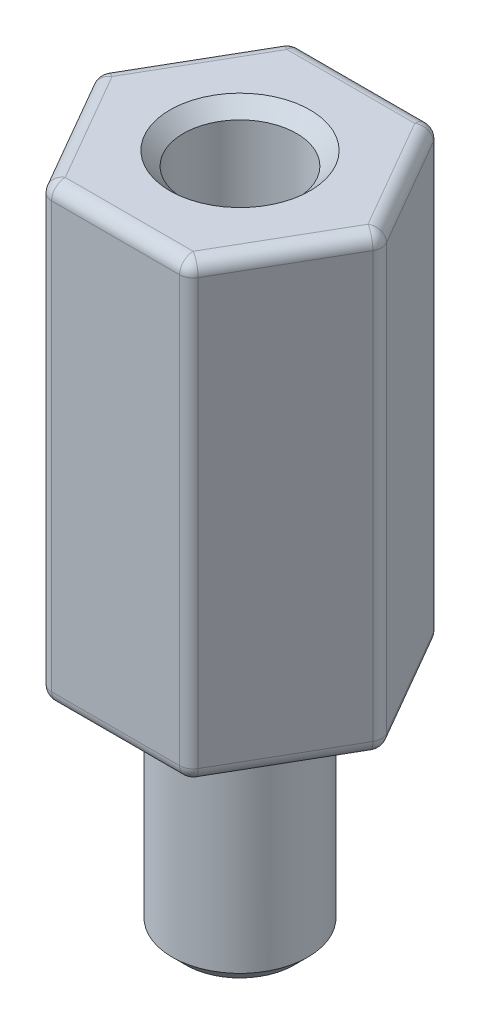
ISO-10303-21;
HEADER;
FILE_DESCRIPTION(('STEP AP214'),'2;1');
FILE_NAME('part.step','',(''),(''),'','','');
FILE_SCHEMA(('AUTOMOTIVE_DESIGN { 1 0 10303 214 1 1 1 1 }'));
ENDSEC;
DATA;
#1=APPLICATION_CONTEXT('core data for automotive mechanical design processes');
#2=APPLICATION_PROTOCOL_DEFINITION('international standard','automotive_design',2000,#1);
#3=PRODUCT_CONTEXT('',#1,'mechanical');
#4=PRODUCT('Part','Part','',(#3));
#5=PRODUCT_RELATED_PRODUCT_CATEGORY('part','',(#4));
#6=PRODUCT_DEFINITION_FORMATION('','',#4);
#7=PRODUCT_DEFINITION_CONTEXT('part definition',#1,'design');
#8=PRODUCT_DEFINITION('design','',#6,#7);
#9=PRODUCT_DEFINITION_SHAPE('','',#8);
#10=(LENGTH_UNIT() NAMED_UNIT(*) SI_UNIT(.MILLI.,.METRE.));
#11=(NAMED_UNIT(*) PLANE_ANGLE_UNIT() SI_UNIT($,.RADIAN.));
#12=(NAMED_UNIT(*) SI_UNIT($,.STERADIAN.) SOLID_ANGLE_UNIT());
#13=UNCERTAINTY_MEASURE_WITH_UNIT(LENGTH_MEASURE(1.E-05),#10,'distance_accuracy_value','');
#14=(GEOMETRIC_REPRESENTATION_CONTEXT(3) GLOBAL_UNCERTAINTY_ASSIGNED_CONTEXT((#13)) GLOBAL_UNIT_ASSIGNED_CONTEXT((#10,
#11,#12)) REPRESENTATION_CONTEXT('',''));
#15=CARTESIAN_POINT('',(0.,0.,0.));
#16=DIRECTION('',(0.,0.,1.));
#17=DIRECTION('',(1.,0.,0.));
#18=AXIS2_PLACEMENT_3D('',#15,#16,#17);
#19=CARTESIAN_POINT('',(0.,10.,0.));
#20=DIRECTION('',(0.,1.,0.));
#21=DIRECTION('',(0.,0.,1.));
#22=AXIS2_PLACEMENT_3D('',#19,#20,#21);
#23=PLANE('',#22);
#24=CARTESIAN_POINT('',(0.,10.,0.));
#25=DIRECTION('',(0.,1.,0.));
#26=DIRECTION('',(0.,0.,1.));
#27=AXIS2_PLACEMENT_3D('',#24,#25,#26);
#28=CIRCLE('',#27,1.55);
#29=CARTESIAN_POINT('',(0.,10.,1.55));
#30=VERTEX_POINT('',#29);
#31=EDGE_CURVE('E288',#30,#30,#28,.F.);
#32=ORIENTED_EDGE('',*,*,#31,.T.);
#33=EDGE_LOOP('',(#32));
#34=FACE_BOUND('',#33,.T.);
#35=DIRECTION('',(-0.5,0.,0.866025403784439));
#36=VECTOR('',#35,1.);
#37=CARTESIAN_POINT('',(-2.82901631902917,10.,0.));
#38=LINE('',#37,#36);
#39=CARTESIAN_POINT('',(-1.41450815951458,10.,-2.45));
#40=VERTEX_POINT('',#39);
#41=CARTESIAN_POINT('',(-2.82901631902917,10.,0.));
#42=VERTEX_POINT('',#41);
#43=EDGE_CURVE('E62',#40,#42,#38,.T.);
#44=ORIENTED_EDGE('',*,*,#43,.T.);
#45=DIRECTION('',(0.5,0.,0.866025403784439));
#46=VECTOR('',#45,1.);
#47=CARTESIAN_POINT('',(-1.41450815951458,10.,2.45));
#48=LINE('',#47,#46);
#49=CARTESIAN_POINT('',(-1.41450815951458,10.,2.45));
#50=VERTEX_POINT('',#49);
#51=EDGE_CURVE('E571',#42,#50,#48,.T.);
#52=ORIENTED_EDGE('',*,*,#51,.T.);
#53=DIRECTION('',(1.,0.,0.));
#54=VECTOR('',#53,1.);
#55=CARTESIAN_POINT('',(1.41450815951458,10.,2.45));
#56=LINE('',#55,#54);
#57=CARTESIAN_POINT('',(1.41450815951458,10.,2.45));
#58=VERTEX_POINT('',#57);
#59=EDGE_CURVE('E563',#50,#58,#56,.T.);
#60=ORIENTED_EDGE('',*,*,#59,.T.);
#61=DIRECTION('',(0.5,0.,-0.866025403784439));
#62=VECTOR('',#61,1.);
#63=CARTESIAN_POINT('',(2.82901631902917,10.,0.));
#64=LINE('',#63,#62);
#65=CARTESIAN_POINT('',(2.82901631902917,10.,0.));
#66=VERTEX_POINT('',#65);
#67=EDGE_CURVE('E565',#58,#66,#64,.T.);
#68=ORIENTED_EDGE('',*,*,#67,.T.);
#69=DIRECTION('',(-0.5,0.,-0.866025403784439));
#70=VECTOR('',#69,1.);
#71=CARTESIAN_POINT('',(1.41450815951459,10.,-2.45));
#72=LINE('',#71,#70);
#73=CARTESIAN_POINT('',(1.41450815951459,10.,-2.45));
#74=VERTEX_POINT('',#73);
#75=EDGE_CURVE('E567',#66,#74,#72,.T.);
#76=ORIENTED_EDGE('',*,*,#75,.T.);
#77=DIRECTION('',(-1.,0.,0.));
#78=VECTOR('',#77,1.);
#79=CARTESIAN_POINT('',(-1.41450815951458,10.,-2.45));
#80=LINE('',#79,#78);
#81=EDGE_CURVE('E67',#74,#40,#80,.T.);
#82=ORIENTED_EDGE('',*,*,#81,.T.);
#83=EDGE_LOOP('',(#44,#52,#60,#68,#76,#82));
#84=FACE_BOUND('',#83,.T.);
#85=ADVANCED_FACE('F47',(#34,#84),#23,.T.);
#86=CARTESIAN_POINT('',(0.,0.,0.));
#87=DIRECTION('',(0.,1.,0.));
#88=DIRECTION('',(0.,0.,1.));
#89=AXIS2_PLACEMENT_3D('',#86,#87,#88);
#90=PLANE('',#89);
#91=CARTESIAN_POINT('',(0.,0.,0.));
#92=DIRECTION('',(0.,1.,0.));
#93=DIRECTION('',(0.,0.,1.));
#94=AXIS2_PLACEMENT_3D('',#91,#92,#93);
#95=CIRCLE('',#94,1.8);
#96=CARTESIAN_POINT('',(0.,0.,1.8));
#97=VERTEX_POINT('',#96);
#98=EDGE_CURVE('E11',#97,#97,#95,.T.);
#99=ORIENTED_EDGE('',*,*,#98,.T.);
#100=EDGE_LOOP('',(#99));
#101=FACE_BOUND('',#100,.T.);
#102=DIRECTION('',(1.,0.,0.));
#103=VECTOR('',#102,1.);
#104=CARTESIAN_POINT('',(0.,0.,2.45));
#105=LINE('',#104,#103);
#106=CARTESIAN_POINT('',(1.41450815951458,0.,2.45));
#107=VERTEX_POINT('',#106);
#108=CARTESIAN_POINT('',(-1.41450815951458,0.,2.45));
#109=VERTEX_POINT('',#108);
#110=EDGE_CURVE('E182',#107,#109,#105,.F.);
#111=ORIENTED_EDGE('',*,*,#110,.T.);
#112=DIRECTION('',(0.5,0.,0.866025403784439));
#113=VECTOR('',#112,1.);
#114=CARTESIAN_POINT('',(-2.12176223927187,0.,1.225));
#115=LINE('',#114,#113);
#116=CARTESIAN_POINT('',(-2.82901631902917,0.,0.));
#117=VERTEX_POINT('',#116);
#118=EDGE_CURVE('E208',#109,#117,#115,.F.);
#119=ORIENTED_EDGE('',*,*,#118,.T.);
#120=DIRECTION('',(-0.5,0.,0.866025403784439));
#121=VECTOR('',#120,1.);
#122=CARTESIAN_POINT('',(-2.12176223927187,0.,-1.225));
#123=LINE('',#122,#121);
#124=CARTESIAN_POINT('',(-1.41450815951458,0.,-2.45));
#125=VERTEX_POINT('',#124);
#126=EDGE_CURVE('E524',#117,#125,#123,.F.);
#127=ORIENTED_EDGE('',*,*,#126,.T.);
#128=DIRECTION('',(-1.,0.,0.));
#129=VECTOR('',#128,1.);
#130=CARTESIAN_POINT('',(0.,0.,-2.45));
#131=LINE('',#130,#129);
#132=CARTESIAN_POINT('',(1.41450815951458,0.,-2.45));
#133=VERTEX_POINT('',#132);
#134=EDGE_CURVE('E522',#125,#133,#131,.F.);
#135=ORIENTED_EDGE('',*,*,#134,.T.);
#136=DIRECTION('',(-0.5,0.,-0.866025403784439));
#137=VECTOR('',#136,1.);
#138=CARTESIAN_POINT('',(2.12176223927188,0.,-1.225));
#139=LINE('',#138,#137);
#140=CARTESIAN_POINT('',(2.82901631902917,0.,0.));
#141=VERTEX_POINT('',#140);
#142=EDGE_CURVE('E520',#133,#141,#139,.F.);
#143=ORIENTED_EDGE('',*,*,#142,.T.);
#144=DIRECTION('',(0.5,0.,-0.866025403784439));
#145=VECTOR('',#144,1.);
#146=CARTESIAN_POINT('',(2.12176223927187,0.,1.225));
#147=LINE('',#146,#145);
#148=EDGE_CURVE('E518',#141,#107,#147,.F.);
#149=ORIENTED_EDGE('',*,*,#148,.T.);
#150=EDGE_LOOP('',(#111,#119,#127,#135,#143,#149));
#151=FACE_BOUND('',#150,.T.);
#152=ADVANCED_FACE('F307',(#101,#151),#90,.F.);
#153=CARTESIAN_POINT('',(1.58771324027147,10.,-2.75));
#154=DIRECTION('',(0.,0.,1.));
#155=DIRECTION('',(1.,0.,0.));
#156=AXIS2_PLACEMENT_3D('',#153,#154,#155);
#157=PLANE('',#156);
#158=DIRECTION('',(0.,-1.,0.));
#159=VECTOR('',#158,1.);
#160=CARTESIAN_POINT('',(1.41450815951458,10.,-2.75));
#161=LINE('',#160,#159);
#162=CARTESIAN_POINT('',(1.41450815951458,9.7,-2.75));
#163=VERTEX_POINT('',#162);
#164=CARTESIAN_POINT('',(1.41450815951458,0.3,-2.75));
#165=VERTEX_POINT('',#164);
#166=EDGE_CURVE('E487',#163,#165,#161,.T.);
#167=ORIENTED_EDGE('',*,*,#166,.T.);
#168=DIRECTION('',(-1.,0.,0.));
#169=VECTOR('',#168,1.);
#170=CARTESIAN_POINT('',(1.58771324027147,0.3,-2.75));
#171=LINE('',#170,#169);
#172=CARTESIAN_POINT('',(-1.41450815951458,0.3,-2.75));
#173=VERTEX_POINT('',#172);
#174=EDGE_CURVE('E541',#165,#173,#171,.T.);
#175=ORIENTED_EDGE('',*,*,#174,.T.);
#176=DIRECTION('',(0.,-1.,0.));
#177=VECTOR('',#176,1.);
#178=CARTESIAN_POINT('',(-1.41450815951458,10.,-2.75));
#179=LINE('',#178,#177);
#180=CARTESIAN_POINT('',(-1.41450815951458,9.7,-2.75));
#181=VERTEX_POINT('',#180);
#182=EDGE_CURVE('E484',#173,#181,#179,.F.);
#183=ORIENTED_EDGE('',*,*,#182,.T.);
#184=DIRECTION('',(-1.,0.,0.));
#185=VECTOR('',#184,1.);
#186=CARTESIAN_POINT('',(1.41450815951458,9.7,-2.75));
#187=LINE('',#186,#185);
#188=EDGE_CURVE('E539',#181,#163,#187,.F.);
#189=ORIENTED_EDGE('',*,*,#188,.T.);
#190=EDGE_LOOP('',(#167,#175,#183,#189));
#191=FACE_BOUND('',#190,.T.);
#192=ADVANCED_FACE('F315',(#191),#157,.F.);
#193=CARTESIAN_POINT('',(-1.58771324027147,10.,-2.75));
#194=DIRECTION('',(0.866025403784439,0.,0.5));
#195=DIRECTION('',(0.5,0.,-0.866025403784439));
#196=AXIS2_PLACEMENT_3D('',#193,#194,#195);
#197=PLANE('',#196);
#198=DIRECTION('',(0.,-1.,0.));
#199=VECTOR('',#198,1.);
#200=CARTESIAN_POINT('',(-1.67431578064991,10.,-2.6));
#201=LINE('',#200,#199);
#202=CARTESIAN_POINT('',(-1.67431578064991,9.7,-2.6));
#203=VERTEX_POINT('',#202);
#204=CARTESIAN_POINT('',(-1.67431578064991,0.3,-2.6));
#205=VERTEX_POINT('',#204);
#206=EDGE_CURVE('E195',#203,#205,#201,.T.);
#207=ORIENTED_EDGE('',*,*,#206,.T.);
#208=DIRECTION('',(-0.5,0.,0.866025403784439));
#209=VECTOR('',#208,1.);
#210=CARTESIAN_POINT('',(-1.58771324027147,0.3,-2.75));
#211=LINE('',#210,#209);
#212=CARTESIAN_POINT('',(-3.0888239401645,0.3,-0.15));
#213=VERTEX_POINT('',#212);
#214=EDGE_CURVE('E533',#205,#213,#211,.T.);
#215=ORIENTED_EDGE('',*,*,#214,.T.);
#216=DIRECTION('',(0.,-1.,0.));
#217=VECTOR('',#216,1.);
#218=CARTESIAN_POINT('',(-3.0888239401645,10.,-0.15));
#219=LINE('',#218,#217);
#220=CARTESIAN_POINT('',(-3.0888239401645,9.7,-0.15));
#221=VERTEX_POINT('',#220);
#222=EDGE_CURVE('E504',#213,#221,#219,.F.);
#223=ORIENTED_EDGE('',*,*,#222,.T.);
#224=DIRECTION('',(-0.5,0.,0.866025403784439));
#225=VECTOR('',#224,1.);
#226=CARTESIAN_POINT('',(-1.67431578064991,9.7,-2.6));
#227=LINE('',#226,#225);
#228=EDGE_CURVE('E531',#221,#203,#227,.F.);
#229=ORIENTED_EDGE('',*,*,#228,.T.);
#230=EDGE_LOOP('',(#207,#215,#223,#229));
#231=FACE_BOUND('',#230,.T.);
#232=ADVANCED_FACE('F336',(#231),#197,.F.);
#233=CARTESIAN_POINT('',(-3.17542648054294,10.,0.));
#234=DIRECTION('',(0.866025403784439,0.,-0.5));
#235=DIRECTION('',(-0.5,0.,-0.866025403784439));
#236=AXIS2_PLACEMENT_3D('',#233,#234,#235);
#237=PLANE('',#236);
#238=DIRECTION('',(0.,-1.,0.));
#239=VECTOR('',#238,1.);
#240=CARTESIAN_POINT('',(-3.0888239401645,10.,0.149999999999999));
#241=LINE('',#240,#239);
#242=CARTESIAN_POINT('',(-3.0888239401645,9.7,0.149999999999999));
#243=VERTEX_POINT('',#242);
#244=CARTESIAN_POINT('',(-3.0888239401645,0.3,0.149999999999999));
#245=VERTEX_POINT('',#244);
#246=EDGE_CURVE('E178',#243,#245,#241,.T.);
#247=ORIENTED_EDGE('',*,*,#246,.T.);
#248=DIRECTION('',(0.5,0.,0.866025403784439));
#249=VECTOR('',#248,1.);
#250=CARTESIAN_POINT('',(-3.17542648054294,0.3,0.));
#251=LINE('',#250,#249);
#252=CARTESIAN_POINT('',(-1.67431578064992,0.3,2.6));
#253=VERTEX_POINT('',#252);
#254=EDGE_CURVE('E173',#245,#253,#251,.T.);
#255=ORIENTED_EDGE('',*,*,#254,.T.);
#256=DIRECTION('',(0.,-1.,0.));
#257=VECTOR('',#256,1.);
#258=CARTESIAN_POINT('',(-1.67431578064992,10.,2.6));
#259=LINE('',#258,#257);
#260=CARTESIAN_POINT('',(-1.67431578064992,9.7,2.6));
#261=VERTEX_POINT('',#260);
#262=EDGE_CURVE('E176',#253,#261,#259,.F.);
#263=ORIENTED_EDGE('',*,*,#262,.T.);
#264=DIRECTION('',(0.5,0.,0.866025403784439));
#265=VECTOR('',#264,1.);
#266=CARTESIAN_POINT('',(-3.0888239401645,9.7,0.149999999999999));
#267=LINE('',#266,#265);
#268=EDGE_CURVE('E183',#261,#243,#267,.F.);
#269=ORIENTED_EDGE('',*,*,#268,.T.);
#270=EDGE_LOOP('',(#247,#255,#263,#269));
#271=FACE_BOUND('',#270,.T.);
#272=ADVANCED_FACE('F175',(#271),#237,.F.);
#273=CARTESIAN_POINT('',(-1.58771324027147,10.,2.75));
#274=DIRECTION('',(0.,0.,-1.));
#275=DIRECTION('',(-1.,0.,0.));
#276=AXIS2_PLACEMENT_3D('',#273,#274,#275);
#277=PLANE('',#276);
#278=DIRECTION('',(0.,-1.,0.));
#279=VECTOR('',#278,1.);
#280=CARTESIAN_POINT('',(-1.41450815951458,10.,2.75));
#281=LINE('',#280,#279);
#282=CARTESIAN_POINT('',(-1.41450815951458,9.7,2.75));
#283=VERTEX_POINT('',#282);
#284=CARTESIAN_POINT('',(-1.41450815951458,0.3,2.75));
#285=VERTEX_POINT('',#284);
#286=EDGE_CURVE('E513',#283,#285,#281,.T.);
#287=ORIENTED_EDGE('',*,*,#286,.T.);
#288=DIRECTION('',(1.,0.,0.));
#289=VECTOR('',#288,1.);
#290=CARTESIAN_POINT('',(-1.58771324027147,0.3,2.75));
#291=LINE('',#290,#289);
#292=CARTESIAN_POINT('',(1.41450815951458,0.3,2.75));
#293=VERTEX_POINT('',#292);
#294=EDGE_CURVE('E217',#285,#293,#291,.T.);
#295=ORIENTED_EDGE('',*,*,#294,.T.);
#296=DIRECTION('',(0.,-1.,0.));
#297=VECTOR('',#296,1.);
#298=CARTESIAN_POINT('',(1.41450815951458,10.,2.75));
#299=LINE('',#298,#297);
#300=CARTESIAN_POINT('',(1.41450815951458,9.7,2.75));
#301=VERTEX_POINT('',#300);
#302=EDGE_CURVE('E510',#293,#301,#299,.F.);
#303=ORIENTED_EDGE('',*,*,#302,.T.);
#304=DIRECTION('',(1.,0.,0.));
#305=VECTOR('',#304,1.);
#306=CARTESIAN_POINT('',(-1.41450815951458,9.7,2.75));
#307=LINE('',#306,#305);
#308=EDGE_CURVE('E572',#301,#283,#307,.F.);
#309=ORIENTED_EDGE('',*,*,#308,.T.);
#310=EDGE_LOOP('',(#287,#295,#303,#309));
#311=FACE_BOUND('',#310,.T.);
#312=ADVANCED_FACE('F329',(#311),#277,.F.);
#313=CARTESIAN_POINT('',(1.58771324027147,10.,2.75));
#314=DIRECTION('',(-0.866025403784439,0.,-0.5));
#315=DIRECTION('',(-0.5,0.,0.866025403784439));
#316=AXIS2_PLACEMENT_3D('',#313,#314,#315);
#317=PLANE('',#316);
#318=DIRECTION('',(0.,-1.,0.));
#319=VECTOR('',#318,1.);
#320=CARTESIAN_POINT('',(1.67431578064991,10.,2.6));
#321=LINE('',#320,#319);
#322=CARTESIAN_POINT('',(1.67431578064991,9.7,2.6));
#323=VERTEX_POINT('',#322);
#324=CARTESIAN_POINT('',(1.67431578064991,0.3,2.6));
#325=VERTEX_POINT('',#324);
#326=EDGE_CURVE('E498',#323,#325,#321,.T.);
#327=ORIENTED_EDGE('',*,*,#326,.T.);
#328=DIRECTION('',(0.5,0.,-0.866025403784439));
#329=VECTOR('',#328,1.);
#330=CARTESIAN_POINT('',(1.58771324027147,0.3,2.75));
#331=LINE('',#330,#329);
#332=CARTESIAN_POINT('',(3.0888239401645,0.3,0.149999999999998));
#333=VERTEX_POINT('',#332);
#334=EDGE_CURVE('E557',#325,#333,#331,.T.);
#335=ORIENTED_EDGE('',*,*,#334,.T.);
#336=DIRECTION('',(0.,-1.,0.));
#337=VECTOR('',#336,1.);
#338=CARTESIAN_POINT('',(3.0888239401645,10.,0.149999999999998));
#339=LINE('',#338,#337);
#340=CARTESIAN_POINT('',(3.0888239401645,9.7,0.149999999999998));
#341=VERTEX_POINT('',#340);
#342=EDGE_CURVE('E501',#333,#341,#339,.F.);
#343=ORIENTED_EDGE('',*,*,#342,.T.);
#344=DIRECTION('',(0.5,0.,-0.866025403784439));
#345=VECTOR('',#344,1.);
#346=CARTESIAN_POINT('',(1.67431578064991,9.7,2.6));
#347=LINE('',#346,#345);
#348=EDGE_CURVE('E555',#341,#323,#347,.F.);
#349=ORIENTED_EDGE('',*,*,#348,.T.);
#350=EDGE_LOOP('',(#327,#335,#343,#349));
#351=FACE_BOUND('',#350,.T.);
#352=ADVANCED_FACE('F325',(#351),#317,.F.);
#353=CARTESIAN_POINT('',(3.17542648054294,10.,0.));
#354=DIRECTION('',(-0.866025403784439,0.,0.5));
#355=DIRECTION('',(0.5,0.,0.866025403784439));
#356=AXIS2_PLACEMENT_3D('',#353,#354,#355);
#357=PLANE('',#356);
#358=DIRECTION('',(0.,-1.,0.));
#359=VECTOR('',#358,1.);
#360=CARTESIAN_POINT('',(3.0888239401645,10.,-0.150000000000002));
#361=LINE('',#360,#359);
#362=CARTESIAN_POINT('',(3.0888239401645,9.7,-0.150000000000002));
#363=VERTEX_POINT('',#362);
#364=CARTESIAN_POINT('',(3.0888239401645,0.3,-0.150000000000002));
#365=VERTEX_POINT('',#364);
#366=EDGE_CURVE('E492',#363,#365,#361,.T.);
#367=ORIENTED_EDGE('',*,*,#366,.T.);
#368=DIRECTION('',(-0.5,0.,-0.866025403784439));
#369=VECTOR('',#368,1.);
#370=CARTESIAN_POINT('',(3.17542648054294,0.3,0.));
#371=LINE('',#370,#369);
#372=CARTESIAN_POINT('',(1.67431578064992,0.3,-2.6));
#373=VERTEX_POINT('',#372);
#374=EDGE_CURVE('E549',#365,#373,#371,.T.);
#375=ORIENTED_EDGE('',*,*,#374,.T.);
#376=DIRECTION('',(0.,-1.,0.));
#377=VECTOR('',#376,1.);
#378=CARTESIAN_POINT('',(1.67431578064992,10.,-2.6));
#379=LINE('',#378,#377);
#380=CARTESIAN_POINT('',(1.67431578064992,9.7,-2.6));
#381=VERTEX_POINT('',#380);
#382=EDGE_CURVE('E495',#373,#381,#379,.F.);
#383=ORIENTED_EDGE('',*,*,#382,.T.);
#384=DIRECTION('',(-0.5,0.,-0.866025403784439));
#385=VECTOR('',#384,1.);
#386=CARTESIAN_POINT('',(3.0888239401645,9.7,-0.150000000000002));
#387=LINE('',#386,#385);
#388=EDGE_CURVE('E547',#381,#363,#387,.F.);
#389=ORIENTED_EDGE('',*,*,#388,.T.);
#390=EDGE_LOOP('',(#367,#375,#383,#389));
#391=FACE_BOUND('',#390,.T.);
#392=ADVANCED_FACE('F322',(#391),#357,.F.);
#393=CARTESIAN_POINT('',(0.,10.,0.));
#394=DIRECTION('',(0.,-1.,0.));
#395=DIRECTION('',(0.,0.,-1.));
#396=AXIS2_PLACEMENT_3D('',#393,#394,#395);
#397=CYLINDRICAL_SURFACE('',#396,1.25);
#398=CARTESIAN_POINT('',(0.,9.7,0.));
#399=DIRECTION('',(0.,1.,0.));
#400=DIRECTION('',(0.,0.,1.));
#401=AXIS2_PLACEMENT_3D('',#398,#399,#400);
#402=CIRCLE('',#401,1.25);
#403=CARTESIAN_POINT('',(0.,9.7,1.25));
#404=VERTEX_POINT('',#403);
#405=EDGE_CURVE('E285',#404,#404,#402,.T.);
#406=ORIENTED_EDGE('',*,*,#405,.T.);
#407=EDGE_LOOP('',(#406));
#408=FACE_BOUND('',#407,.T.);
#409=CARTESIAN_POINT('',(0.,0.,0.));
#410=DIRECTION('',(0.,1.,0.));
#411=DIRECTION('',(0.,0.,1.));
#412=AXIS2_PLACEMENT_3D('',#409,#410,#411);
#413=CIRCLE('',#412,1.25);
#414=CARTESIAN_POINT('',(0.,0.,1.25));
#415=VERTEX_POINT('',#414);
#416=EDGE_CURVE('E248',#415,#415,#413,.T.);
#417=ORIENTED_EDGE('',*,*,#416,.F.);
#418=EDGE_LOOP('',(#417));
#419=FACE_BOUND('',#418,.T.);
#420=ADVANCED_FACE('F319',(#408,#419),#397,.F.);
#421=CARTESIAN_POINT('',(1.41450815951458,10.,-2.45));
#422=DIRECTION('',(0.,-1.,0.));
#423=DIRECTION('',(0.,0.,-1.));
#424=AXIS2_PLACEMENT_3D('',#421,#422,#423);
#425=CYLINDRICAL_SURFACE('',#424,0.3);
#426=ORIENTED_EDGE('',*,*,#382,.F.);
#427=CARTESIAN_POINT('',(1.41450815951458,0.3,-2.45));
#428=DIRECTION('',(0.,-1.,0.));
#429=DIRECTION('',(0.,0.,-1.));
#430=AXIS2_PLACEMENT_3D('',#427,#428,#429);
#431=CIRCLE('',#430,0.3);
#432=EDGE_CURVE('E545',#373,#165,#431,.F.);
#433=ORIENTED_EDGE('',*,*,#432,.T.);
#434=ORIENTED_EDGE('',*,*,#166,.F.);
#435=CARTESIAN_POINT('',(1.41450815951458,9.7,-2.45));
#436=DIRECTION('',(0.,-1.,0.));
#437=DIRECTION('',(0.,0.,-1.));
#438=AXIS2_PLACEMENT_3D('',#435,#436,#437);
#439=CIRCLE('',#438,0.3);
#440=EDGE_CURVE('E543',#163,#381,#439,.T.);
#441=ORIENTED_EDGE('',*,*,#440,.T.);
#442=EDGE_LOOP('',(#426,#433,#434,#441));
#443=FACE_BOUND('',#442,.T.);
#444=ADVANCED_FACE('F343',(#443),#425,.T.);
#445=CARTESIAN_POINT('',(2.82901631902917,10.,0.));
#446=DIRECTION('',(0.,-1.,0.));
#447=DIRECTION('',(0.,0.,-1.));
#448=AXIS2_PLACEMENT_3D('',#445,#446,#447);
#449=CYLINDRICAL_SURFACE('',#448,0.3);
#450=ORIENTED_EDGE('',*,*,#342,.F.);
#451=CARTESIAN_POINT('',(2.82901631902917,0.3,0.));
#452=DIRECTION('',(0.,-1.,0.));
#453=DIRECTION('',(0.,0.,-1.));
#454=AXIS2_PLACEMENT_3D('',#451,#452,#453);
#455=CIRCLE('',#454,0.3);
#456=EDGE_CURVE('E553',#333,#365,#455,.F.);
#457=ORIENTED_EDGE('',*,*,#456,.T.);
#458=ORIENTED_EDGE('',*,*,#366,.F.);
#459=CARTESIAN_POINT('',(2.82901631902917,9.7,0.));
#460=DIRECTION('',(0.,-1.,0.));
#461=DIRECTION('',(0.,0.,-1.));
#462=AXIS2_PLACEMENT_3D('',#459,#460,#461);
#463=CIRCLE('',#462,0.3);
#464=EDGE_CURVE('E551',#363,#341,#463,.T.);
#465=ORIENTED_EDGE('',*,*,#464,.T.);
#466=EDGE_LOOP('',(#450,#457,#458,#465));
#467=FACE_BOUND('',#466,.T.);
#468=ADVANCED_FACE('F346',(#467),#449,.T.);
#469=CARTESIAN_POINT('',(-1.41450815951458,10.,-2.45));
#470=DIRECTION('',(0.,-1.,0.));
#471=DIRECTION('',(0.,0.,-1.));
#472=AXIS2_PLACEMENT_3D('',#469,#470,#471);
#473=CYLINDRICAL_SURFACE('',#472,0.3);
#474=ORIENTED_EDGE('',*,*,#182,.F.);
#475=CARTESIAN_POINT('',(-1.41450815951458,0.3,-2.45));
#476=DIRECTION('',(0.,-1.,0.));
#477=DIRECTION('',(0.,0.,-1.));
#478=AXIS2_PLACEMENT_3D('',#475,#476,#477);
#479=CIRCLE('',#478,0.3);
#480=EDGE_CURVE('E537',#173,#205,#479,.F.);
#481=ORIENTED_EDGE('',*,*,#480,.T.);
#482=ORIENTED_EDGE('',*,*,#206,.F.);
#483=CARTESIAN_POINT('',(-1.41450815951458,9.7,-2.45));
#484=DIRECTION('',(0.,-1.,0.));
#485=DIRECTION('',(0.,0.,-1.));
#486=AXIS2_PLACEMENT_3D('',#483,#484,#485);
#487=CIRCLE('',#486,0.3);
#488=EDGE_CURVE('E535',#203,#181,#487,.T.);
#489=ORIENTED_EDGE('',*,*,#488,.T.);
#490=EDGE_LOOP('',(#474,#481,#482,#489));
#491=FACE_BOUND('',#490,.T.);
#492=ADVANCED_FACE('F350',(#491),#473,.T.);
#493=CARTESIAN_POINT('',(-2.82901631902917,10.,0.));
#494=DIRECTION('',(0.,-1.,0.));
#495=DIRECTION('',(0.,0.,-1.));
#496=AXIS2_PLACEMENT_3D('',#493,#494,#495);
#497=CYLINDRICAL_SURFACE('',#496,0.3);
#498=ORIENTED_EDGE('',*,*,#222,.F.);
#499=CARTESIAN_POINT('',(-2.82901631902917,0.3,0.));
#500=DIRECTION('',(0.,-1.,0.));
#501=DIRECTION('',(0.,0.,-1.));
#502=AXIS2_PLACEMENT_3D('',#499,#500,#501);
#503=CIRCLE('',#502,0.3);
#504=EDGE_CURVE('E529',#213,#245,#503,.F.);
#505=ORIENTED_EDGE('',*,*,#504,.T.);
#506=ORIENTED_EDGE('',*,*,#246,.F.);
#507=CARTESIAN_POINT('',(-2.82901631902917,9.7,0.));
#508=DIRECTION('',(0.,-1.,0.));
#509=DIRECTION('',(0.,0.,-1.));
#510=AXIS2_PLACEMENT_3D('',#507,#508,#509);
#511=CIRCLE('',#510,0.3);
#512=EDGE_CURVE('E527',#243,#221,#511,.T.);
#513=ORIENTED_EDGE('',*,*,#512,.T.);
#514=EDGE_LOOP('',(#498,#505,#506,#513));
#515=FACE_BOUND('',#514,.T.);
#516=ADVANCED_FACE('F354',(#515),#497,.T.);
#517=CARTESIAN_POINT('',(-1.41450815951458,10.,2.45));
#518=DIRECTION('',(0.,-1.,0.));
#519=DIRECTION('',(0.,0.,-1.));
#520=AXIS2_PLACEMENT_3D('',#517,#518,#519);
#521=CYLINDRICAL_SURFACE('',#520,0.3);
#522=ORIENTED_EDGE('',*,*,#262,.F.);
#523=CARTESIAN_POINT('',(-1.41450815951458,0.3,2.45));
#524=DIRECTION('',(0.,-1.,0.));
#525=DIRECTION('',(0.,0.,-1.));
#526=AXIS2_PLACEMENT_3D('',#523,#524,#525);
#527=CIRCLE('',#526,0.3);
#528=EDGE_CURVE('E191',#253,#285,#527,.F.);
#529=ORIENTED_EDGE('',*,*,#528,.T.);
#530=ORIENTED_EDGE('',*,*,#286,.F.);
#531=CARTESIAN_POINT('',(-1.41450815951458,9.7,2.45));
#532=DIRECTION('',(0.,-1.,0.));
#533=DIRECTION('',(0.,0.,-1.));
#534=AXIS2_PLACEMENT_3D('',#531,#532,#533);
#535=CIRCLE('',#534,0.3);
#536=EDGE_CURVE('E194',#283,#261,#535,.T.);
#537=ORIENTED_EDGE('',*,*,#536,.T.);
#538=EDGE_LOOP('',(#522,#529,#530,#537));
#539=FACE_BOUND('',#538,.T.);
#540=ADVANCED_FACE('F189',(#539),#521,.T.);
#541=CARTESIAN_POINT('',(1.41450815951458,10.,2.45));
#542=DIRECTION('',(0.,-1.,0.));
#543=DIRECTION('',(0.,0.,-1.));
#544=AXIS2_PLACEMENT_3D('',#541,#542,#543);
#545=CYLINDRICAL_SURFACE('',#544,0.3);
#546=ORIENTED_EDGE('',*,*,#302,.F.);
#547=CARTESIAN_POINT('',(1.41450815951458,0.3,2.45));
#548=DIRECTION('',(0.,-1.,0.));
#549=DIRECTION('',(0.,0.,-1.));
#550=AXIS2_PLACEMENT_3D('',#547,#548,#549);
#551=CIRCLE('',#550,0.3);
#552=EDGE_CURVE('E561',#293,#325,#551,.F.);
#553=ORIENTED_EDGE('',*,*,#552,.T.);
#554=ORIENTED_EDGE('',*,*,#326,.F.);
#555=CARTESIAN_POINT('',(1.41450815951458,9.7,2.45));
#556=DIRECTION('',(0.,-1.,0.));
#557=DIRECTION('',(0.,0.,-1.));
#558=AXIS2_PLACEMENT_3D('',#555,#556,#557);
#559=CIRCLE('',#558,0.3);
#560=EDGE_CURVE('E559',#323,#301,#559,.T.);
#561=ORIENTED_EDGE('',*,*,#560,.T.);
#562=EDGE_LOOP('',(#546,#553,#554,#561));
#563=FACE_BOUND('',#562,.T.);
#564=ADVANCED_FACE('F361',(#563),#545,.T.);
#565=CARTESIAN_POINT('',(1.41450815951458,0.3,-2.45));
#566=DIRECTION('',(0.,1.,0.));
#567=DIRECTION('',(0.,0.,1.));
#568=AXIS2_PLACEMENT_3D('',#565,#566,#567);
#569=SPHERICAL_SURFACE('',#568,0.3);
#570=CARTESIAN_POINT('',(1.41450815951458,0.3,-2.45));
#571=DIRECTION('',(-1.,0.,0.));
#572=DIRECTION('',(0.,0.,1.));
#573=AXIS2_PLACEMENT_3D('',#570,#571,#572);
#574=CIRCLE('',#573,0.3);
#575=EDGE_CURVE('E242',#165,#133,#574,.T.);
#576=ORIENTED_EDGE('',*,*,#575,.F.);
#577=ORIENTED_EDGE('',*,*,#432,.F.);
#578=CARTESIAN_POINT('',(1.41450815951458,0.3,-2.45));
#579=DIRECTION('',(0.499999999999999,0.,0.866025403784439));
#580=DIRECTION('',(0.866025403784439,0.,-0.499999999999999));
#581=AXIS2_PLACEMENT_3D('',#578,#579,#580);
#582=CIRCLE('',#581,0.3);
#583=EDGE_CURVE('E245',#133,#373,#582,.T.);
#584=ORIENTED_EDGE('',*,*,#583,.F.);
#585=EDGE_LOOP('',(#576,#577,#584));
#586=FACE_BOUND('',#585,.T.);
#587=ADVANCED_FACE('F364',(#586),#569,.T.);
#588=CARTESIAN_POINT('',(2.91561885940761,0.3,0.149999999999998));
#589=DIRECTION('',(-0.5,0.,-0.866025403784439));
#590=DIRECTION('',(-0.866025403784439,0.,0.5));
#591=AXIS2_PLACEMENT_3D('',#588,#589,#590);
#592=CYLINDRICAL_SURFACE('',#591,0.3);
#593=ORIENTED_EDGE('',*,*,#583,.T.);
#594=ORIENTED_EDGE('',*,*,#374,.F.);
#595=CARTESIAN_POINT('',(2.82901631902917,0.3,0.));
#596=DIRECTION('',(0.5,0.,0.866025403784439));
#597=DIRECTION('',(0.866025403784439,0.,-0.5));
#598=AXIS2_PLACEMENT_3D('',#595,#596,#597);
#599=CIRCLE('',#598,0.3);
#600=EDGE_CURVE('E239',#141,#365,#599,.T.);
#601=ORIENTED_EDGE('',*,*,#600,.F.);
#602=ORIENTED_EDGE('',*,*,#142,.F.);
#603=EDGE_LOOP('',(#593,#594,#601,#602));
#604=FACE_BOUND('',#603,.T.);
#605=ADVANCED_FACE('F402',(#604),#592,.T.);
#606=CARTESIAN_POINT('',(1.58771324027147,0.3,-2.45));
#607=DIRECTION('',(-1.,0.,0.));
#608=DIRECTION('',(0.,0.,1.));
#609=AXIS2_PLACEMENT_3D('',#606,#607,#608);
#610=CYLINDRICAL_SURFACE('',#609,0.3);
#611=ORIENTED_EDGE('',*,*,#575,.T.);
#612=ORIENTED_EDGE('',*,*,#134,.F.);
#613=CARTESIAN_POINT('',(-1.41450815951458,0.3,-2.45));
#614=DIRECTION('',(-1.,0.,0.));
#615=DIRECTION('',(0.,-1.,0.));
#616=AXIS2_PLACEMENT_3D('',#613,#614,#615);
#617=CIRCLE('',#616,0.3);
#618=EDGE_CURVE('E236',#173,#125,#617,.T.);
#619=ORIENTED_EDGE('',*,*,#618,.F.);
#620=ORIENTED_EDGE('',*,*,#174,.F.);
#621=EDGE_LOOP('',(#611,#612,#619,#620));
#622=FACE_BOUND('',#621,.T.);
#623=ADVANCED_FACE('F398',(#622),#610,.T.);
#624=CARTESIAN_POINT('',(2.82901631902917,0.3,0.));
#625=DIRECTION('',(0.,1.,0.));
#626=DIRECTION('',(0.,0.,1.));
#627=AXIS2_PLACEMENT_3D('',#624,#625,#626);
#628=SPHERICAL_SURFACE('',#627,0.3);
#629=ORIENTED_EDGE('',*,*,#600,.T.);
#630=ORIENTED_EDGE('',*,*,#456,.F.);
#631=CARTESIAN_POINT('',(2.82901631902917,0.3,0.));
#632=DIRECTION('',(-0.5,0.,0.866025403784439));
#633=DIRECTION('',(0.866025403784439,0.,0.5));
#634=AXIS2_PLACEMENT_3D('',#631,#632,#633);
#635=CIRCLE('',#634,0.3);
#636=EDGE_CURVE('E233',#141,#333,#635,.T.);
#637=ORIENTED_EDGE('',*,*,#636,.F.);
#638=EDGE_LOOP('',(#629,#630,#637));
#639=FACE_BOUND('',#638,.T.);
#640=ADVANCED_FACE('F394',(#639),#628,.T.);
#641=CARTESIAN_POINT('',(-1.41450815951458,0.3,-2.45));
#642=DIRECTION('',(0.,1.,0.));
#643=DIRECTION('',(0.,0.,1.));
#644=AXIS2_PLACEMENT_3D('',#641,#642,#643);
#645=SPHERICAL_SURFACE('',#644,0.3);
#646=ORIENTED_EDGE('',*,*,#480,.F.);
#647=ORIENTED_EDGE('',*,*,#618,.T.);
#648=CARTESIAN_POINT('',(-1.41450815951458,0.3,-2.45));
#649=DIRECTION('',(-0.5,0.,0.866025403784439));
#650=DIRECTION('',(0.866025403784439,0.,0.5));
#651=AXIS2_PLACEMENT_3D('',#648,#649,#650);
#652=CIRCLE('',#651,0.3);
#653=EDGE_CURVE('E230',#205,#125,#652,.T.);
#654=ORIENTED_EDGE('',*,*,#653,.F.);
#655=EDGE_LOOP('',(#646,#647,#654));
#656=FACE_BOUND('',#655,.T.);
#657=ADVANCED_FACE('F390',(#656),#645,.T.);
#658=CARTESIAN_POINT('',(1.32790561913614,0.3,2.6));
#659=DIRECTION('',(0.5,0.,-0.866025403784439));
#660=DIRECTION('',(-0.866025403784439,0.,-0.5));
#661=AXIS2_PLACEMENT_3D('',#658,#659,#660);
#662=CYLINDRICAL_SURFACE('',#661,0.3);
#663=ORIENTED_EDGE('',*,*,#636,.T.);
#664=ORIENTED_EDGE('',*,*,#334,.F.);
#665=CARTESIAN_POINT('',(1.41450815951458,0.3,2.45));
#666=DIRECTION('',(-0.5,0.,0.866025403784439));
#667=DIRECTION('',(0.866025403784439,0.,0.5));
#668=AXIS2_PLACEMENT_3D('',#665,#666,#667);
#669=CIRCLE('',#668,0.3);
#670=EDGE_CURVE('E227',#107,#325,#669,.T.);
#671=ORIENTED_EDGE('',*,*,#670,.F.);
#672=ORIENTED_EDGE('',*,*,#148,.F.);
#673=EDGE_LOOP('',(#663,#664,#671,#672));
#674=FACE_BOUND('',#673,.T.);
#675=ADVANCED_FACE('F386',(#674),#662,.T.);
#676=CARTESIAN_POINT('',(-1.32790561913614,0.3,-2.6));
#677=DIRECTION('',(-0.5,0.,0.866025403784439));
#678=DIRECTION('',(0.866025403784439,0.,0.5));
#679=AXIS2_PLACEMENT_3D('',#676,#677,#678);
#680=CYLINDRICAL_SURFACE('',#679,0.3);
#681=ORIENTED_EDGE('',*,*,#653,.T.);
#682=ORIENTED_EDGE('',*,*,#126,.F.);
#683=CARTESIAN_POINT('',(-2.82901631902917,0.3,0.));
#684=DIRECTION('',(-0.5,0.,0.866025403784438));
#685=DIRECTION('',(0.866025403784438,0.,0.5));
#686=AXIS2_PLACEMENT_3D('',#683,#684,#685);
#687=CIRCLE('',#686,0.3);
#688=EDGE_CURVE('E224',#213,#117,#687,.T.);
#689=ORIENTED_EDGE('',*,*,#688,.F.);
#690=ORIENTED_EDGE('',*,*,#214,.F.);
#691=EDGE_LOOP('',(#681,#682,#689,#690));
#692=FACE_BOUND('',#691,.T.);
#693=ADVANCED_FACE('F382',(#692),#680,.T.);
#694=CARTESIAN_POINT('',(1.41450815951458,0.3,2.45));
#695=DIRECTION('',(0.,1.,0.));
#696=DIRECTION('',(0.,0.,1.));
#697=AXIS2_PLACEMENT_3D('',#694,#695,#696);
#698=SPHERICAL_SURFACE('',#697,0.3);
#699=ORIENTED_EDGE('',*,*,#670,.T.);
#700=ORIENTED_EDGE('',*,*,#552,.F.);
#701=CARTESIAN_POINT('',(1.41450815951458,0.3,2.45));
#702=DIRECTION('',(-1.,0.,0.));
#703=DIRECTION('',(0.,0.,1.));
#704=AXIS2_PLACEMENT_3D('',#701,#702,#703);
#705=CIRCLE('',#704,0.3);
#706=EDGE_CURVE('E221',#107,#293,#705,.T.);
#707=ORIENTED_EDGE('',*,*,#706,.F.);
#708=EDGE_LOOP('',(#699,#700,#707));
#709=FACE_BOUND('',#708,.T.);
#710=ADVANCED_FACE('F378',(#709),#698,.T.);
#711=CARTESIAN_POINT('',(-2.82901631902917,0.3,0.));
#712=DIRECTION('',(0.,1.,0.));
#713=DIRECTION('',(0.,0.,1.));
#714=AXIS2_PLACEMENT_3D('',#711,#712,#713);
#715=SPHERICAL_SURFACE('',#714,0.3);
#716=ORIENTED_EDGE('',*,*,#504,.F.);
#717=ORIENTED_EDGE('',*,*,#688,.T.);
#718=CARTESIAN_POINT('',(-2.82901631902917,0.3,0.));
#719=DIRECTION('',(0.5,0.,0.866025403784438));
#720=DIRECTION('',(0.866025403784439,0.,-0.5));
#721=AXIS2_PLACEMENT_3D('',#718,#719,#720);
#722=CIRCLE('',#721,0.3);
#723=EDGE_CURVE('E211',#245,#117,#722,.T.);
#724=ORIENTED_EDGE('',*,*,#723,.F.);
#725=EDGE_LOOP('',(#716,#717,#724));
#726=FACE_BOUND('',#725,.T.);
#727=ADVANCED_FACE('F374',(#726),#715,.T.);
#728=CARTESIAN_POINT('',(-1.58771324027147,0.3,2.45));
#729=DIRECTION('',(1.,0.,0.));
#730=DIRECTION('',(0.,0.,-1.));
#731=AXIS2_PLACEMENT_3D('',#728,#729,#730);
#732=CYLINDRICAL_SURFACE('',#731,0.3);
#733=ORIENTED_EDGE('',*,*,#706,.T.);
#734=ORIENTED_EDGE('',*,*,#294,.F.);
#735=CARTESIAN_POINT('',(-1.41450815951458,0.3,2.45));
#736=DIRECTION('',(-1.,0.,0.));
#737=DIRECTION('',(0.,0.,1.));
#738=AXIS2_PLACEMENT_3D('',#735,#736,#737);
#739=CIRCLE('',#738,0.3);
#740=EDGE_CURVE('E202',#109,#285,#739,.T.);
#741=ORIENTED_EDGE('',*,*,#740,.F.);
#742=ORIENTED_EDGE('',*,*,#110,.F.);
#743=EDGE_LOOP('',(#733,#734,#741,#742));
#744=FACE_BOUND('',#743,.T.);
#745=ADVANCED_FACE('F371',(#744),#732,.T.);
#746=CARTESIAN_POINT('',(-2.91561885940761,0.3,-0.150000000000001));
#747=DIRECTION('',(0.5,0.,0.866025403784439));
#748=DIRECTION('',(0.866025403784439,0.,-0.5));
#749=AXIS2_PLACEMENT_3D('',#746,#747,#748);
#750=CYLINDRICAL_SURFACE('',#749,0.3);
#751=ORIENTED_EDGE('',*,*,#723,.T.);
#752=ORIENTED_EDGE('',*,*,#118,.F.);
#753=CARTESIAN_POINT('',(-1.41450815951458,0.3,2.45));
#754=DIRECTION('',(0.5,0.,0.866025403784439));
#755=DIRECTION('',(0.866025403784439,0.,-0.5));
#756=AXIS2_PLACEMENT_3D('',#753,#754,#755);
#757=CIRCLE('',#756,0.3);
#758=EDGE_CURVE('E200',#253,#109,#757,.T.);
#759=ORIENTED_EDGE('',*,*,#758,.F.);
#760=ORIENTED_EDGE('',*,*,#254,.F.);
#761=EDGE_LOOP('',(#751,#752,#759,#760));
#762=FACE_BOUND('',#761,.T.);
#763=ADVANCED_FACE('F206',(#762),#750,.T.);
#764=CARTESIAN_POINT('',(-1.41450815951458,0.3,2.45));
#765=DIRECTION('',(0.,1.,0.));
#766=DIRECTION('',(0.,0.,1.));
#767=AXIS2_PLACEMENT_3D('',#764,#765,#766);
#768=SPHERICAL_SURFACE('',#767,0.3);
#769=ORIENTED_EDGE('',*,*,#740,.T.);
#770=ORIENTED_EDGE('',*,*,#528,.F.);
#771=ORIENTED_EDGE('',*,*,#758,.T.);
#772=EDGE_LOOP('',(#769,#770,#771));
#773=FACE_BOUND('',#772,.T.);
#774=ADVANCED_FACE('F199',(#773),#768,.T.);
#775=CARTESIAN_POINT('',(1.41450815951458,9.7,-2.45));
#776=DIRECTION('',(0.,1.,0.));
#777=DIRECTION('',(0.,0.,1.));
#778=AXIS2_PLACEMENT_3D('',#775,#776,#777);
#779=SPHERICAL_SURFACE('',#778,0.3);
#780=CARTESIAN_POINT('',(1.41450815951458,9.7,-2.45));
#781=DIRECTION('',(0.499999999999998,0.,0.86602540378444));
#782=DIRECTION('',(0.86602540378444,0.,-0.499999999999998));
#783=AXIS2_PLACEMENT_3D('',#780,#781,#782);
#784=CIRCLE('',#783,0.3);
#785=EDGE_CURVE('E214',#381,#74,#784,.T.);
#786=ORIENTED_EDGE('',*,*,#785,.F.);
#787=ORIENTED_EDGE('',*,*,#440,.F.);
#788=CARTESIAN_POINT('',(1.41450815951458,9.7,-2.45));
#789=DIRECTION('',(-1.,0.,0.));
#790=DIRECTION('',(0.,0.,1.));
#791=AXIS2_PLACEMENT_3D('',#788,#789,#790);
#792=CIRCLE('',#791,0.3);
#793=EDGE_CURVE('E209',#74,#163,#792,.T.);
#794=ORIENTED_EDGE('',*,*,#793,.F.);
#795=EDGE_LOOP('',(#786,#787,#794));
#796=FACE_BOUND('',#795,.T.);
#797=ADVANCED_FACE('F368',(#796),#779,.T.);
#798=CARTESIAN_POINT('',(0.,9.7,-2.45));
#799=DIRECTION('',(1.,0.,0.));
#800=DIRECTION('',(0.,0.,-1.));
#801=AXIS2_PLACEMENT_3D('',#798,#799,#800);
#802=CYLINDRICAL_SURFACE('',#801,0.3);
#803=ORIENTED_EDGE('',*,*,#793,.T.);
#804=ORIENTED_EDGE('',*,*,#188,.F.);
#805=CARTESIAN_POINT('',(-1.41450815951458,9.7,-2.45));
#806=DIRECTION('',(-1.,0.,0.));
#807=DIRECTION('',(0.,0.,1.));
#808=AXIS2_PLACEMENT_3D('',#805,#806,#807);
#809=CIRCLE('',#808,0.3);
#810=EDGE_CURVE('E274',#40,#181,#809,.T.);
#811=ORIENTED_EDGE('',*,*,#810,.F.);
#812=ORIENTED_EDGE('',*,*,#81,.F.);
#813=EDGE_LOOP('',(#803,#804,#811,#812));
#814=FACE_BOUND('',#813,.T.);
#815=ADVANCED_FACE('F450',(#814),#802,.T.);
#816=CARTESIAN_POINT('',(2.12176223927188,9.7,-1.225));
#817=DIRECTION('',(0.5,0.,0.866025403784439));
#818=DIRECTION('',(0.866025403784439,0.,-0.5));
#819=AXIS2_PLACEMENT_3D('',#816,#817,#818);
#820=CYLINDRICAL_SURFACE('',#819,0.3);
#821=ORIENTED_EDGE('',*,*,#785,.T.);
#822=ORIENTED_EDGE('',*,*,#75,.F.);
#823=CARTESIAN_POINT('',(2.82901631902917,9.7,0.));
#824=DIRECTION('',(0.5,0.,0.866025403784439));
#825=DIRECTION('',(0.866025403784439,0.,-0.5));
#826=AXIS2_PLACEMENT_3D('',#823,#824,#825);
#827=CIRCLE('',#826,0.3);
#828=EDGE_CURVE('E271',#363,#66,#827,.T.);
#829=ORIENTED_EDGE('',*,*,#828,.F.);
#830=ORIENTED_EDGE('',*,*,#388,.F.);
#831=EDGE_LOOP('',(#821,#822,#829,#830));
#832=FACE_BOUND('',#831,.T.);
#833=ADVANCED_FACE('F446',(#832),#820,.T.);
#834=CARTESIAN_POINT('',(-1.41450815951458,9.7,-2.45));
#835=DIRECTION('',(0.,1.,0.));
#836=DIRECTION('',(0.,0.,1.));
#837=AXIS2_PLACEMENT_3D('',#834,#835,#836);
#838=SPHERICAL_SURFACE('',#837,0.3);
#839=ORIENTED_EDGE('',*,*,#810,.T.);
#840=ORIENTED_EDGE('',*,*,#488,.F.);
#841=CARTESIAN_POINT('',(-1.41450815951458,9.7,-2.45));
#842=DIRECTION('',(-0.5,0.,0.866025403784439));
#843=DIRECTION('',(0.866025403784439,0.,0.5));
#844=AXIS2_PLACEMENT_3D('',#841,#842,#843);
#845=CIRCLE('',#844,0.3);
#846=EDGE_CURVE('E268',#40,#203,#845,.T.);
#847=ORIENTED_EDGE('',*,*,#846,.F.);
#848=EDGE_LOOP('',(#839,#840,#847));
#849=FACE_BOUND('',#848,.T.);
#850=ADVANCED_FACE('F442',(#849),#838,.T.);
#851=CARTESIAN_POINT('',(2.82901631902917,9.7,0.));
#852=DIRECTION('',(0.,1.,0.));
#853=DIRECTION('',(0.,0.,1.));
#854=AXIS2_PLACEMENT_3D('',#851,#852,#853);
#855=SPHERICAL_SURFACE('',#854,0.3);
#856=ORIENTED_EDGE('',*,*,#464,.F.);
#857=ORIENTED_EDGE('',*,*,#828,.T.);
#858=CARTESIAN_POINT('',(2.82901631902917,9.7,0.));
#859=DIRECTION('',(-0.5,0.,0.866025403784439));
#860=DIRECTION('',(0.866025403784439,0.,0.5));
#861=AXIS2_PLACEMENT_3D('',#858,#859,#860);
#862=CIRCLE('',#861,0.3);
#863=EDGE_CURVE('E265',#341,#66,#862,.T.);
#864=ORIENTED_EDGE('',*,*,#863,.F.);
#865=EDGE_LOOP('',(#856,#857,#864));
#866=FACE_BOUND('',#865,.T.);
#867=ADVANCED_FACE('F438',(#866),#855,.T.);
#868=CARTESIAN_POINT('',(-2.12176223927187,9.7,-1.225));
#869=DIRECTION('',(0.5,0.,-0.866025403784439));
#870=DIRECTION('',(-0.866025403784439,0.,-0.5));
#871=AXIS2_PLACEMENT_3D('',#868,#869,#870);
#872=CYLINDRICAL_SURFACE('',#871,0.3);
#873=ORIENTED_EDGE('',*,*,#846,.T.);
#874=ORIENTED_EDGE('',*,*,#228,.F.);
#875=CARTESIAN_POINT('',(-2.82901631902917,9.7,0.));
#876=DIRECTION('',(-0.499999999999998,0.,0.86602540378444));
#877=DIRECTION('',(0.86602540378444,0.,0.499999999999998));
#878=AXIS2_PLACEMENT_3D('',#875,#876,#877);
#879=CIRCLE('',#878,0.3);
#880=EDGE_CURVE('E262',#42,#221,#879,.T.);
#881=ORIENTED_EDGE('',*,*,#880,.F.);
#882=ORIENTED_EDGE('',*,*,#43,.F.);
#883=EDGE_LOOP('',(#873,#874,#881,#882));
#884=FACE_BOUND('',#883,.T.);
#885=ADVANCED_FACE('F434',(#884),#872,.T.);
#886=CARTESIAN_POINT('',(2.12176223927187,9.7,1.225));
#887=DIRECTION('',(-0.5,0.,0.866025403784439));
#888=DIRECTION('',(0.866025403784439,0.,0.5));
#889=AXIS2_PLACEMENT_3D('',#886,#887,#888);
#890=CYLINDRICAL_SURFACE('',#889,0.3);
#891=ORIENTED_EDGE('',*,*,#863,.T.);
#892=ORIENTED_EDGE('',*,*,#67,.F.);
#893=CARTESIAN_POINT('',(1.41450815951458,9.7,2.45));
#894=DIRECTION('',(-0.5,0.,0.866025403784439));
#895=DIRECTION('',(0.866025403784439,0.,0.5));
#896=AXIS2_PLACEMENT_3D('',#893,#894,#895);
#897=CIRCLE('',#896,0.3);
#898=EDGE_CURVE('E259',#323,#58,#897,.T.);
#899=ORIENTED_EDGE('',*,*,#898,.F.);
#900=ORIENTED_EDGE('',*,*,#348,.F.);
#901=EDGE_LOOP('',(#891,#892,#899,#900));
#902=FACE_BOUND('',#901,.T.);
#903=ADVANCED_FACE('F430',(#902),#890,.T.);
#904=CARTESIAN_POINT('',(-2.82901631902917,9.7,0.));
#905=DIRECTION('',(0.,1.,0.));
#906=DIRECTION('',(0.,0.,1.));
#907=AXIS2_PLACEMENT_3D('',#904,#905,#906);
#908=SPHERICAL_SURFACE('',#907,0.3);
#909=ORIENTED_EDGE('',*,*,#880,.T.);
#910=ORIENTED_EDGE('',*,*,#512,.F.);
#911=CARTESIAN_POINT('',(-2.82901631902917,9.7,0.));
#912=DIRECTION('',(0.5,0.,0.866025403784439));
#913=DIRECTION('',(0.866025403784439,0.,-0.5));
#914=AXIS2_PLACEMENT_3D('',#911,#912,#913);
#915=CIRCLE('',#914,0.3);
#916=EDGE_CURVE('E256',#42,#243,#915,.T.);
#917=ORIENTED_EDGE('',*,*,#916,.F.);
#918=EDGE_LOOP('',(#909,#910,#917));
#919=FACE_BOUND('',#918,.T.);
#920=ADVANCED_FACE('F426',(#919),#908,.T.);
#921=CARTESIAN_POINT('',(1.41450815951458,9.7,2.45));
#922=DIRECTION('',(0.,1.,0.));
#923=DIRECTION('',(0.,0.,1.));
#924=AXIS2_PLACEMENT_3D('',#921,#922,#923);
#925=SPHERICAL_SURFACE('',#924,0.3);
#926=ORIENTED_EDGE('',*,*,#560,.F.);
#927=ORIENTED_EDGE('',*,*,#898,.T.);
#928=CARTESIAN_POINT('',(1.41450815951458,9.7,2.45));
#929=DIRECTION('',(-1.,0.,0.));
#930=DIRECTION('',(0.,0.,1.));
#931=AXIS2_PLACEMENT_3D('',#928,#929,#930);
#932=CIRCLE('',#931,0.3);
#933=EDGE_CURVE('E253',#301,#58,#932,.T.);
#934=ORIENTED_EDGE('',*,*,#933,.F.);
#935=EDGE_LOOP('',(#926,#927,#934));
#936=FACE_BOUND('',#935,.T.);
#937=ADVANCED_FACE('F422',(#936),#925,.T.);
#938=CARTESIAN_POINT('',(-2.12176223927187,9.7,1.225));
#939=DIRECTION('',(-0.5,0.,-0.866025403784439));
#940=DIRECTION('',(-0.866025403784439,0.,0.5));
#941=AXIS2_PLACEMENT_3D('',#938,#939,#940);
#942=CYLINDRICAL_SURFACE('',#941,0.3);
#943=ORIENTED_EDGE('',*,*,#916,.T.);
#944=ORIENTED_EDGE('',*,*,#268,.F.);
#945=CARTESIAN_POINT('',(-1.41450815951458,9.7,2.45));
#946=DIRECTION('',(0.5,0.,0.866025403784439));
#947=DIRECTION('',(0.866025403784439,0.,-0.5));
#948=AXIS2_PLACEMENT_3D('',#945,#946,#947);
#949=CIRCLE('',#948,0.3);
#950=EDGE_CURVE('E251',#50,#261,#949,.T.);
#951=ORIENTED_EDGE('',*,*,#950,.F.);
#952=ORIENTED_EDGE('',*,*,#51,.F.);
#953=EDGE_LOOP('',(#943,#944,#951,#952));
#954=FACE_BOUND('',#953,.T.);
#955=ADVANCED_FACE('F418',(#954),#942,.T.);
#956=CARTESIAN_POINT('',(0.,9.7,2.45));
#957=DIRECTION('',(-1.,0.,0.));
#958=DIRECTION('',(0.,0.,1.));
#959=AXIS2_PLACEMENT_3D('',#956,#957,#958);
#960=CYLINDRICAL_SURFACE('',#959,0.3);
#961=ORIENTED_EDGE('',*,*,#933,.T.);
#962=ORIENTED_EDGE('',*,*,#59,.F.);
#963=CARTESIAN_POINT('',(-1.41450815951458,9.7,2.45));
#964=DIRECTION('',(-1.,0.,0.));
#965=DIRECTION('',(0.,0.,1.));
#966=AXIS2_PLACEMENT_3D('',#963,#964,#965);
#967=CIRCLE('',#966,0.3);
#968=EDGE_CURVE('E249',#283,#50,#967,.T.);
#969=ORIENTED_EDGE('',*,*,#968,.F.);
#970=ORIENTED_EDGE('',*,*,#308,.F.);
#971=EDGE_LOOP('',(#961,#962,#969,#970));
#972=FACE_BOUND('',#971,.T.);
#973=ADVANCED_FACE('F414',(#972),#960,.T.);
#974=CARTESIAN_POINT('',(-1.41450815951458,9.7,2.45));
#975=DIRECTION('',(0.,1.,0.));
#976=DIRECTION('',(0.,0.,1.));
#977=AXIS2_PLACEMENT_3D('',#974,#975,#976);
#978=SPHERICAL_SURFACE('',#977,0.3);
#979=ORIENTED_EDGE('',*,*,#950,.T.);
#980=ORIENTED_EDGE('',*,*,#536,.F.);
#981=ORIENTED_EDGE('',*,*,#968,.T.);
#982=EDGE_LOOP('',(#979,#980,#981));
#983=FACE_BOUND('',#982,.T.);
#984=ADVANCED_FACE('F410',(#983),#978,.T.);
#985=CARTESIAN_POINT('',(0.,0.,0.));
#986=DIRECTION('',(0.,-1.,0.));
#987=DIRECTION('',(0.,0.,-1.));
#988=AXIS2_PLACEMENT_3D('',#985,#986,#987);
#989=PLANE('',#988);
#990=ORIENTED_EDGE('',*,*,#416,.T.);
#991=EDGE_LOOP('',(#990));
#992=FACE_BOUND('',#991,.T.);
#993=ADVANCED_FACE('F413',(#992),#989,.F.);
#994=CARTESIAN_POINT('',(0.,-5.,0.));
#995=DIRECTION('',(0.,1.,0.));
#996=DIRECTION('',(0.,0.,1.));
#997=AXIS2_PLACEMENT_3D('',#994,#995,#996);
#998=CYLINDRICAL_SURFACE('',#997,1.5);
#999=CARTESIAN_POINT('',(0.,-0.3,0.));
#1000=DIRECTION('',(0.,1.,0.));
#1001=DIRECTION('',(0.,0.,1.));
#1002=AXIS2_PLACEMENT_3D('',#999,#1000,#1001);
#1003=CIRCLE('',#1002,1.5);
#1004=CARTESIAN_POINT('',(0.,-0.3,1.5));
#1005=VERTEX_POINT('',#1004);
#1006=EDGE_CURVE('E55',#1005,#1005,#1003,.F.);
#1007=ORIENTED_EDGE('',*,*,#1006,.T.);
#1008=EDGE_LOOP('',(#1007));
#1009=FACE_BOUND('',#1008,.T.);
#1010=CARTESIAN_POINT('',(0.,-4.7,0.));
#1011=DIRECTION('',(0.,-1.,0.));
#1012=DIRECTION('',(0.,0.,-1.));
#1013=AXIS2_PLACEMENT_3D('',#1010,#1011,#1012);
#1014=CIRCLE('',#1013,1.5);
#1015=CARTESIAN_POINT('',(0.,-4.7,-1.5));
#1016=VERTEX_POINT('',#1015);
#1017=EDGE_CURVE('E282',#1016,#1016,#1014,.F.);
#1018=ORIENTED_EDGE('',*,*,#1017,.T.);
#1019=EDGE_LOOP('',(#1018));
#1020=FACE_BOUND('',#1019,.T.);
#1021=ADVANCED_FACE('F293',(#1009,#1020),#998,.T.);
#1022=CARTESIAN_POINT('',(0.,-5.,0.));
#1023=DIRECTION('',(0.,-1.,0.));
#1024=DIRECTION('',(0.,0.,-1.));
#1025=AXIS2_PLACEMENT_3D('',#1022,#1023,#1024);
#1026=PLANE('',#1025);
#1027=CARTESIAN_POINT('',(0.,-5.,0.));
#1028=DIRECTION('',(0.,-1.,0.));
#1029=DIRECTION('',(0.,0.,-1.));
#1030=AXIS2_PLACEMENT_3D('',#1027,#1028,#1029);
#1031=CIRCLE('',#1030,1.2);
#1032=CARTESIAN_POINT('',(0.,-5.,-1.2));
#1033=VERTEX_POINT('',#1032);
#1034=EDGE_CURVE('E279',#1033,#1033,#1031,.T.);
#1035=ORIENTED_EDGE('',*,*,#1034,.T.);
#1036=EDGE_LOOP('',(#1035));
#1037=FACE_BOUND('',#1036,.T.);
#1038=ADVANCED_FACE('F463',(#1037),#1026,.T.);
#1039=CARTESIAN_POINT('',(0.,-5.,0.));
#1040=DIRECTION('',(0.,1.,0.));
#1041=DIRECTION('',(0.,0.,1.));
#1042=AXIS2_PLACEMENT_3D('',#1039,#1040,#1041);
#1043=CONICAL_SURFACE('',#1042,1.2,0.785398163397445);
#1044=ORIENTED_EDGE('',*,*,#1017,.F.);
#1045=EDGE_LOOP('',(#1044));
#1046=FACE_BOUND('',#1045,.T.);
#1047=ORIENTED_EDGE('',*,*,#1034,.F.);
#1048=EDGE_LOOP('',(#1047));
#1049=FACE_BOUND('',#1048,.T.);
#1050=ADVANCED_FACE('F303',(#1046,#1049),#1043,.T.);
#1051=CARTESIAN_POINT('',(0.,9.7,0.));
#1052=DIRECTION('',(0.,1.,0.));
#1053=DIRECTION('',(0.,0.,1.));
#1054=AXIS2_PLACEMENT_3D('',#1051,#1052,#1053);
#1055=CONICAL_SURFACE('',#1054,1.25,0.78539816339745);
#1056=ORIENTED_EDGE('',*,*,#31,.F.);
#1057=EDGE_LOOP('',(#1056));
#1058=FACE_BOUND('',#1057,.T.);
#1059=ORIENTED_EDGE('',*,*,#405,.F.);
#1060=EDGE_LOOP('',(#1059));
#1061=FACE_BOUND('',#1060,.T.);
#1062=ADVANCED_FACE('F297',(#1058,#1061),#1055,.F.);
#1063=CARTESIAN_POINT('',(0.,-0.3,0.));
#1064=DIRECTION('',(0.,1.,0.));
#1065=DIRECTION('',(0.,0.,1.));
#1066=AXIS2_PLACEMENT_3D('',#1063,#1064,#1065);
#1067=TOROIDAL_SURFACE('',#1066,1.8,0.3);
#1068=ORIENTED_EDGE('',*,*,#98,.F.);
#1069=EDGE_LOOP('',(#1068));
#1070=FACE_BOUND('',#1069,.T.);
#1071=ORIENTED_EDGE('',*,*,#1006,.F.);
#1072=EDGE_LOOP('',(#1071));
#1073=FACE_BOUND('',#1072,.T.);
#1074=ADVANCED_FACE('F49',(#1070,#1073),#1067,.F.);
#1075=CLOSED_SHELL('',(#85,#152,#192,#232,#272,#312,#352,#392,#420,#444,#468,#492,#516,#540,
#564,#587,#605,#623,#640,#657,#675,#693,#710,#727,#745,#763,#774,#797,#815,#833,#850,#867,#885,
#903,#920,#937,#955,#973,#984,#993,#1021,#1038,#1050,#1062,#1074));
#1076=MANIFOLD_SOLID_BREP('B2',#1075);
#1077=ADVANCED_BREP_SHAPE_REPRESENTATION('',(#18,#1076),#14);
#1078=SHAPE_DEFINITION_REPRESENTATION(#9,#1077);
ENDSEC;
END-ISO-10303-21;
